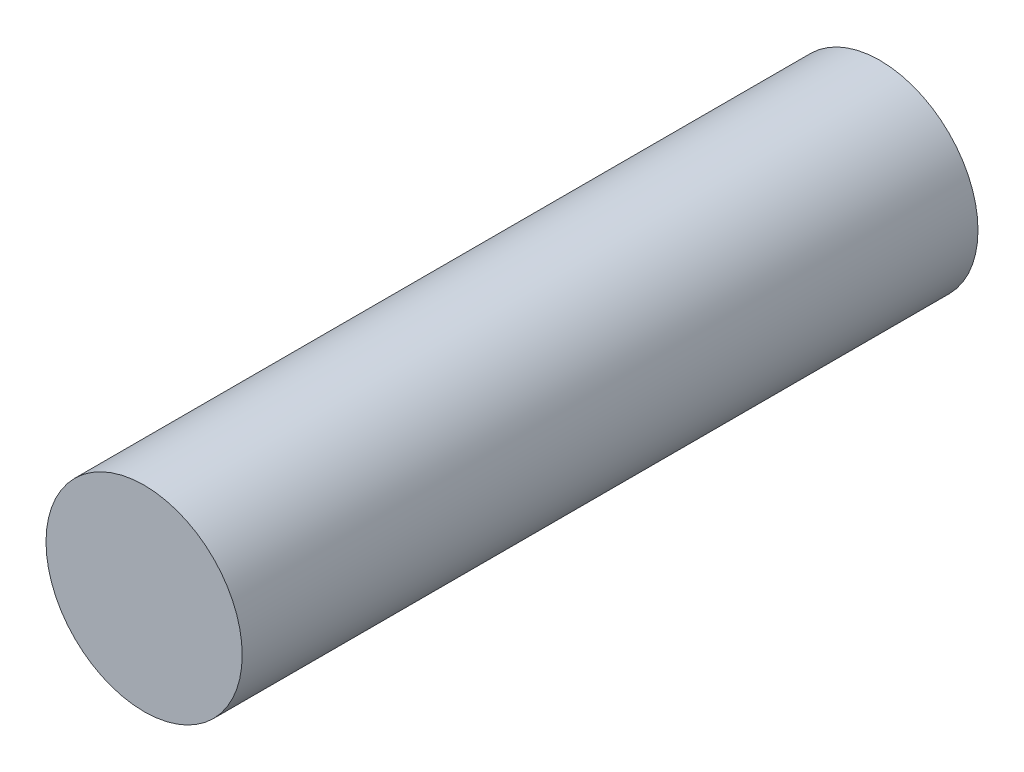
ISO-10303-21;
HEADER;
FILE_DESCRIPTION(('STEP AP214'),'2;1');
FILE_NAME('part.step','',(''),(''),'','','');
FILE_SCHEMA(('AUTOMOTIVE_DESIGN { 1 0 10303 214 1 1 1 1 }'));
ENDSEC;
DATA;
#1=APPLICATION_CONTEXT('core data for automotive mechanical design processes');
#2=APPLICATION_PROTOCOL_DEFINITION('international standard','automotive_design',2000,#1);
#3=PRODUCT_CONTEXT('',#1,'mechanical');
#4=PRODUCT('Part','Part','',(#3));
#5=PRODUCT_RELATED_PRODUCT_CATEGORY('part','',(#4));
#6=PRODUCT_DEFINITION_FORMATION('','',#4);
#7=PRODUCT_DEFINITION_CONTEXT('part definition',#1,'design');
#8=PRODUCT_DEFINITION('design','',#6,#7);
#9=PRODUCT_DEFINITION_SHAPE('','',#8);
#10=(LENGTH_UNIT() NAMED_UNIT(*) SI_UNIT(.MILLI.,.METRE.));
#11=(NAMED_UNIT(*) PLANE_ANGLE_UNIT() SI_UNIT($,.RADIAN.));
#12=(NAMED_UNIT(*) SI_UNIT($,.STERADIAN.) SOLID_ANGLE_UNIT());
#13=UNCERTAINTY_MEASURE_WITH_UNIT(LENGTH_MEASURE(1.E-05),#10,'distance_accuracy_value','');
#14=(GEOMETRIC_REPRESENTATION_CONTEXT(3) GLOBAL_UNCERTAINTY_ASSIGNED_CONTEXT((#13)) GLOBAL_UNIT_ASSIGNED_CONTEXT((#10,
#11,#12)) REPRESENTATION_CONTEXT('',''));
#15=CARTESIAN_POINT('',(0.,0.,0.));
#16=DIRECTION('',(0.,0.,1.));
#17=DIRECTION('',(1.,0.,0.));
#18=AXIS2_PLACEMENT_3D('',#15,#16,#17);
#19=CARTESIAN_POINT('',(0.,0.,95.25));
#20=DIRECTION('',(0.,0.,-1.));
#21=DIRECTION('',(-1.,0.,0.));
#22=AXIS2_PLACEMENT_3D('',#19,#20,#21);
#23=CYLINDRICAL_SURFACE('',#22,12.7);
#24=CARTESIAN_POINT('',(0.,0.,95.25));
#25=DIRECTION('',(0.,0.,1.));
#26=DIRECTION('',(1.,0.,0.));
#27=AXIS2_PLACEMENT_3D('',#24,#25,#26);
#28=CIRCLE('',#27,12.7);
#29=CARTESIAN_POINT('',(12.7,0.,95.25));
#30=VERTEX_POINT('',#29);
#31=EDGE_CURVE('E11',#30,#30,#28,.T.);
#32=ORIENTED_EDGE('',*,*,#31,.F.);
#33=EDGE_LOOP('',(#32));
#34=FACE_BOUND('',#33,.T.);
#35=CARTESIAN_POINT('',(0.,0.,0.));
#36=DIRECTION('',(0.,0.,1.));
#37=DIRECTION('',(1.,0.,0.));
#38=AXIS2_PLACEMENT_3D('',#35,#36,#37);
#39=CIRCLE('',#38,12.7);
#40=CARTESIAN_POINT('',(12.7,0.,0.));
#41=VERTEX_POINT('',#40);
#42=EDGE_CURVE('E35',#41,#41,#39,.T.);
#43=ORIENTED_EDGE('',*,*,#42,.T.);
#44=EDGE_LOOP('',(#43));
#45=FACE_BOUND('',#44,.T.);
#46=ADVANCED_FACE('F32',(#34,#45),#23,.T.);
#47=CARTESIAN_POINT('',(0.,0.,95.25));
#48=DIRECTION('',(0.,0.,1.));
#49=DIRECTION('',(1.,0.,0.));
#50=AXIS2_PLACEMENT_3D('',#47,#48,#49);
#51=PLANE('',#50);
#52=ORIENTED_EDGE('',*,*,#31,.T.);
#53=EDGE_LOOP('',(#52));
#54=FACE_BOUND('',#53,.T.);
#55=ADVANCED_FACE('F157',(#54),#51,.T.);
#56=CARTESIAN_POINT('',(0.,0.,0.));
#57=DIRECTION('',(0.,0.,1.));
#58=DIRECTION('',(1.,0.,0.));
#59=AXIS2_PLACEMENT_3D('',#56,#57,#58);
#60=PLANE('',#59);
#61=DIRECTION('',(0.866025403784439,0.5,0.));
#62=VECTOR('',#61,1.);
#63=CARTESIAN_POINT('',(-6.35,3.66617420935413,0.));
#64=LINE('',#63,#62);
#65=CARTESIAN_POINT('',(-6.35,3.66617420935413,0.));
#66=VERTEX_POINT('',#65);
#67=CARTESIAN_POINT('',(0.,7.33234841870825,0.));
#68=VERTEX_POINT('',#67);
#69=EDGE_CURVE('E120',#66,#68,#64,.T.);
#70=ORIENTED_EDGE('',*,*,#69,.F.);
#71=DIRECTION('',(0.,1.,0.));
#72=VECTOR('',#71,1.);
#73=CARTESIAN_POINT('',(-6.35,-3.66617420935412,0.));
#74=LINE('',#73,#72);
#75=CARTESIAN_POINT('',(-6.35,-3.66617420935412,0.));
#76=VERTEX_POINT('',#75);
#77=EDGE_CURVE('E46',#76,#66,#74,.T.);
#78=ORIENTED_EDGE('',*,*,#77,.F.);
#79=DIRECTION('',(-0.866025403784438,0.5,0.));
#80=VECTOR('',#79,1.);
#81=CARTESIAN_POINT('',(0.,-7.33234841870824,0.));
#82=LINE('',#81,#80);
#83=CARTESIAN_POINT('',(0.,-7.33234841870824,0.));
#84=VERTEX_POINT('',#83);
#85=EDGE_CURVE('E129',#84,#76,#82,.T.);
#86=ORIENTED_EDGE('',*,*,#85,.F.);
#87=DIRECTION('',(-0.866025403784439,-0.5,0.));
#88=VECTOR('',#87,1.);
#89=CARTESIAN_POINT('',(6.35,-3.66617420935412,0.));
#90=LINE('',#89,#88);
#91=CARTESIAN_POINT('',(6.35,-3.66617420935412,0.));
#92=VERTEX_POINT('',#91);
#93=EDGE_CURVE('E127',#92,#84,#90,.T.);
#94=ORIENTED_EDGE('',*,*,#93,.F.);
#95=DIRECTION('',(0.,-1.,0.));
#96=VECTOR('',#95,1.);
#97=CARTESIAN_POINT('',(6.35,3.66617420935413,0.));
#98=LINE('',#97,#96);
#99=CARTESIAN_POINT('',(6.35,3.66617420935413,0.));
#100=VERTEX_POINT('',#99);
#101=EDGE_CURVE('E94',#100,#92,#98,.T.);
#102=ORIENTED_EDGE('',*,*,#101,.F.);
#103=DIRECTION('',(0.866025403784439,-0.5,0.));
#104=VECTOR('',#103,1.);
#105=CARTESIAN_POINT('',(0.,7.33234841870825,0.));
#106=LINE('',#105,#104);
#107=EDGE_CURVE('E123',#68,#100,#106,.T.);
#108=ORIENTED_EDGE('',*,*,#107,.F.);
#109=EDGE_LOOP('',(#70,#78,#86,#94,#102,#108));
#110=FACE_BOUND('',#109,.T.);
#111=ORIENTED_EDGE('',*,*,#42,.F.);
#112=EDGE_LOOP('',(#111));
#113=FACE_BOUND('',#112,.T.);
#114=ADVANCED_FACE('F142',(#110,#113),#60,.F.);
#115=CARTESIAN_POINT('',(-6.35,-3.66617420935412,39.878));
#116=DIRECTION('',(-1.,0.,0.));
#117=DIRECTION('',(0.,-1.,0.));
#118=AXIS2_PLACEMENT_3D('',#115,#116,#117);
#119=PLANE('',#118);
#120=ORIENTED_EDGE('',*,*,#77,.T.);
#121=DIRECTION('',(0.,0.,-1.));
#122=VECTOR('',#121,1.);
#123=CARTESIAN_POINT('',(-6.35,3.66617420935413,39.878));
#124=LINE('',#123,#122);
#125=CARTESIAN_POINT('',(-6.35,3.66617420935413,39.878));
#126=VERTEX_POINT('',#125);
#127=EDGE_CURVE('E76',#126,#66,#124,.T.);
#128=ORIENTED_EDGE('',*,*,#127,.F.);
#129=DIRECTION('',(0.,1.,0.));
#130=VECTOR('',#129,1.);
#131=CARTESIAN_POINT('',(-6.35,-3.66617420935412,39.878));
#132=LINE('',#131,#130);
#133=CARTESIAN_POINT('',(-6.35,-3.66617420935412,39.878));
#134=VERTEX_POINT('',#133);
#135=EDGE_CURVE('E131',#134,#126,#132,.T.);
#136=ORIENTED_EDGE('',*,*,#135,.F.);
#137=DIRECTION('',(0.,0.,-1.));
#138=VECTOR('',#137,1.);
#139=CARTESIAN_POINT('',(-6.35,-3.66617420935412,39.878));
#140=LINE('',#139,#138);
#141=EDGE_CURVE('E54',#134,#76,#140,.T.);
#142=ORIENTED_EDGE('',*,*,#141,.T.);
#143=EDGE_LOOP('',(#120,#128,#136,#142));
#144=FACE_BOUND('',#143,.T.);
#145=ADVANCED_FACE('F148',(#144),#119,.F.);
#146=CARTESIAN_POINT('',(0.,-7.33234841870824,39.878));
#147=DIRECTION('',(-0.5,-0.866025403784438,0.));
#148=DIRECTION('',(0.866025403784438,-0.5,0.));
#149=AXIS2_PLACEMENT_3D('',#146,#147,#148);
#150=PLANE('',#149);
#151=ORIENTED_EDGE('',*,*,#85,.T.);
#152=ORIENTED_EDGE('',*,*,#141,.F.);
#153=DIRECTION('',(-0.866025403784438,0.5,0.));
#154=VECTOR('',#153,1.);
#155=CARTESIAN_POINT('',(0.,-7.33234841870824,39.878));
#156=LINE('',#155,#154);
#157=CARTESIAN_POINT('',(0.,-7.33234841870824,39.878));
#158=VERTEX_POINT('',#157);
#159=EDGE_CURVE('E106',#158,#134,#156,.T.);
#160=ORIENTED_EDGE('',*,*,#159,.F.);
#161=DIRECTION('',(0.,0.,-1.));
#162=VECTOR('',#161,1.);
#163=CARTESIAN_POINT('',(0.,-7.33234841870824,39.878));
#164=LINE('',#163,#162);
#165=EDGE_CURVE('E98',#158,#84,#164,.T.);
#166=ORIENTED_EDGE('',*,*,#165,.T.);
#167=EDGE_LOOP('',(#151,#152,#160,#166));
#168=FACE_BOUND('',#167,.T.);
#169=ADVANCED_FACE('F150',(#168),#150,.F.);
#170=CARTESIAN_POINT('',(6.35,-3.66617420935412,39.878));
#171=DIRECTION('',(0.5,-0.866025403784439,0.));
#172=DIRECTION('',(0.866025403784439,0.5,0.));
#173=AXIS2_PLACEMENT_3D('',#170,#171,#172);
#174=PLANE('',#173);
#175=ORIENTED_EDGE('',*,*,#93,.T.);
#176=ORIENTED_EDGE('',*,*,#165,.F.);
#177=DIRECTION('',(-0.866025403784439,-0.5,0.));
#178=VECTOR('',#177,1.);
#179=CARTESIAN_POINT('',(6.35,-3.66617420935412,39.878));
#180=LINE('',#179,#178);
#181=CARTESIAN_POINT('',(6.35,-3.66617420935412,39.878));
#182=VERTEX_POINT('',#181);
#183=EDGE_CURVE('E102',#182,#158,#180,.T.);
#184=ORIENTED_EDGE('',*,*,#183,.F.);
#185=DIRECTION('',(0.,0.,-1.));
#186=VECTOR('',#185,1.);
#187=CARTESIAN_POINT('',(6.35,-3.66617420935412,39.878));
#188=LINE('',#187,#186);
#189=EDGE_CURVE('E87',#182,#92,#188,.T.);
#190=ORIENTED_EDGE('',*,*,#189,.T.);
#191=EDGE_LOOP('',(#175,#176,#184,#190));
#192=FACE_BOUND('',#191,.T.);
#193=ADVANCED_FACE('F103',(#192),#174,.F.);
#194=CARTESIAN_POINT('',(6.35,3.66617420935413,39.878));
#195=DIRECTION('',(1.,0.,0.));
#196=DIRECTION('',(0.,1.,0.));
#197=AXIS2_PLACEMENT_3D('',#194,#195,#196);
#198=PLANE('',#197);
#199=ORIENTED_EDGE('',*,*,#101,.T.);
#200=ORIENTED_EDGE('',*,*,#189,.F.);
#201=DIRECTION('',(0.,-1.,0.));
#202=VECTOR('',#201,1.);
#203=CARTESIAN_POINT('',(6.35,3.66617420935413,39.878));
#204=LINE('',#203,#202);
#205=CARTESIAN_POINT('',(6.35,3.66617420935413,39.878));
#206=VERTEX_POINT('',#205);
#207=EDGE_CURVE('E91',#206,#182,#204,.T.);
#208=ORIENTED_EDGE('',*,*,#207,.F.);
#209=DIRECTION('',(0.,0.,-1.));
#210=VECTOR('',#209,1.);
#211=CARTESIAN_POINT('',(6.35,3.66617420935413,39.878));
#212=LINE('',#211,#210);
#213=EDGE_CURVE('E99',#206,#100,#212,.T.);
#214=ORIENTED_EDGE('',*,*,#213,.T.);
#215=EDGE_LOOP('',(#199,#200,#208,#214));
#216=FACE_BOUND('',#215,.T.);
#217=ADVANCED_FACE('F89',(#216),#198,.F.);
#218=CARTESIAN_POINT('',(0.,7.33234841870825,39.878));
#219=DIRECTION('',(0.5,0.866025403784439,0.));
#220=DIRECTION('',(-0.866025403784439,0.5,0.));
#221=AXIS2_PLACEMENT_3D('',#218,#219,#220);
#222=PLANE('',#221);
#223=ORIENTED_EDGE('',*,*,#107,.T.);
#224=ORIENTED_EDGE('',*,*,#213,.F.);
#225=DIRECTION('',(0.866025403784439,-0.5,0.));
#226=VECTOR('',#225,1.);
#227=CARTESIAN_POINT('',(0.,7.33234841870825,39.878));
#228=LINE('',#227,#226);
#229=CARTESIAN_POINT('',(0.,7.33234841870825,39.878));
#230=VERTEX_POINT('',#229);
#231=EDGE_CURVE('E112',#230,#206,#228,.T.);
#232=ORIENTED_EDGE('',*,*,#231,.F.);
#233=DIRECTION('',(0.,0.,-1.));
#234=VECTOR('',#233,1.);
#235=CARTESIAN_POINT('',(0.,7.33234841870825,39.878));
#236=LINE('',#235,#234);
#237=EDGE_CURVE('E135',#230,#68,#236,.T.);
#238=ORIENTED_EDGE('',*,*,#237,.T.);
#239=EDGE_LOOP('',(#223,#224,#232,#238));
#240=FACE_BOUND('',#239,.T.);
#241=ADVANCED_FACE('F146',(#240),#222,.F.);
#242=CARTESIAN_POINT('',(-6.35,3.66617420935413,39.878));
#243=DIRECTION('',(-0.5,0.866025403784439,0.));
#244=DIRECTION('',(-0.866025403784439,-0.5,0.));
#245=AXIS2_PLACEMENT_3D('',#242,#243,#244);
#246=PLANE('',#245);
#247=ORIENTED_EDGE('',*,*,#69,.T.);
#248=ORIENTED_EDGE('',*,*,#237,.F.);
#249=DIRECTION('',(0.866025403784439,0.5,0.));
#250=VECTOR('',#249,1.);
#251=CARTESIAN_POINT('',(-6.35,3.66617420935413,39.878));
#252=LINE('',#251,#250);
#253=EDGE_CURVE('E114',#126,#230,#252,.T.);
#254=ORIENTED_EDGE('',*,*,#253,.F.);
#255=ORIENTED_EDGE('',*,*,#127,.T.);
#256=EDGE_LOOP('',(#247,#248,#254,#255));
#257=FACE_BOUND('',#256,.T.);
#258=ADVANCED_FACE('F139',(#257),#246,.F.);
#259=CARTESIAN_POINT('',(0.,0.,39.878));
#260=DIRECTION('',(0.,0.,-1.));
#261=DIRECTION('',(-1.,0.,0.));
#262=AXIS2_PLACEMENT_3D('',#259,#260,#261);
#263=PLANE('',#262);
#264=ORIENTED_EDGE('',*,*,#135,.T.);
#265=ORIENTED_EDGE('',*,*,#253,.T.);
#266=ORIENTED_EDGE('',*,*,#231,.T.);
#267=ORIENTED_EDGE('',*,*,#207,.T.);
#268=ORIENTED_EDGE('',*,*,#183,.T.);
#269=ORIENTED_EDGE('',*,*,#159,.T.);
#270=EDGE_LOOP('',(#264,#265,#266,#267,#268,#269));
#271=FACE_BOUND('',#270,.T.);
#272=ADVANCED_FACE('F109',(#271),#263,.T.);
#273=CLOSED_SHELL('',(#46,#55,#114,#145,#169,#193,#217,#241,#258,#272));
#274=MANIFOLD_SOLID_BREP('B2',#273);
#275=ADVANCED_BREP_SHAPE_REPRESENTATION('',(#18,#274),#14);
#276=SHAPE_DEFINITION_REPRESENTATION(#9,#275);
ENDSEC;
END-ISO-10303-21;
